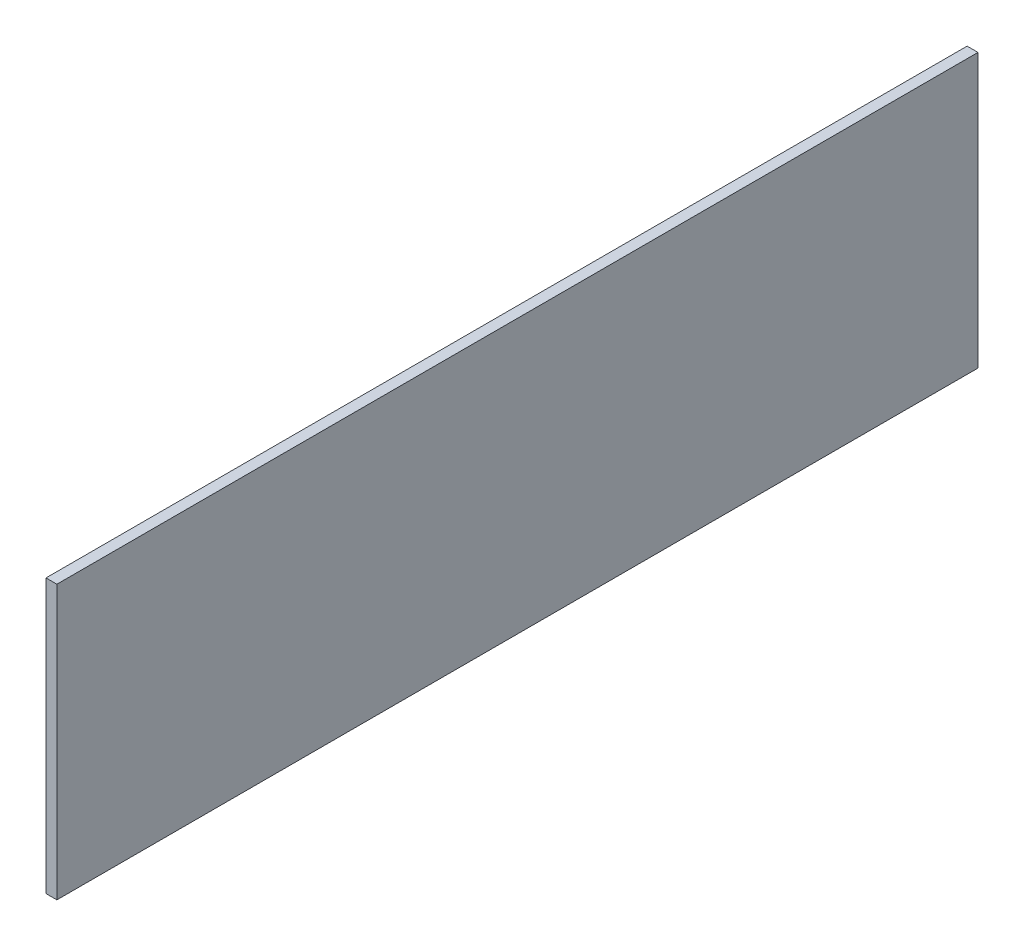
ISO-10303-21;
HEADER;
FILE_DESCRIPTION(('STEP AP214'),'2;1');
FILE_NAME('part.step','',(''),(''),'','','');
FILE_SCHEMA(('AUTOMOTIVE_DESIGN { 1 0 10303 214 1 1 1 1 }'));
ENDSEC;
DATA;
#1=APPLICATION_CONTEXT('core data for automotive mechanical design processes');
#2=APPLICATION_PROTOCOL_DEFINITION('international standard','automotive_design',2000,#1);
#3=PRODUCT_CONTEXT('',#1,'mechanical');
#4=PRODUCT('Part','Part','',(#3));
#5=PRODUCT_RELATED_PRODUCT_CATEGORY('part','',(#4));
#6=PRODUCT_DEFINITION_FORMATION('','',#4);
#7=PRODUCT_DEFINITION_CONTEXT('part definition',#1,'design');
#8=PRODUCT_DEFINITION('design','',#6,#7);
#9=PRODUCT_DEFINITION_SHAPE('','',#8);
#10=(LENGTH_UNIT() NAMED_UNIT(*) SI_UNIT(.MILLI.,.METRE.));
#11=(NAMED_UNIT(*) PLANE_ANGLE_UNIT() SI_UNIT($,.RADIAN.));
#12=(NAMED_UNIT(*) SI_UNIT($,.STERADIAN.) SOLID_ANGLE_UNIT());
#13=UNCERTAINTY_MEASURE_WITH_UNIT(LENGTH_MEASURE(1.E-05),#10,'distance_accuracy_value','');
#14=(GEOMETRIC_REPRESENTATION_CONTEXT(3) GLOBAL_UNCERTAINTY_ASSIGNED_CONTEXT((#13)) GLOBAL_UNIT_ASSIGNED_CONTEXT((#10,
#11,#12)) REPRESENTATION_CONTEXT('',''));
#15=CARTESIAN_POINT('',(0.,0.,0.));
#16=DIRECTION('',(0.,0.,1.));
#17=DIRECTION('',(1.,0.,0.));
#18=AXIS2_PLACEMENT_3D('',#15,#16,#17);
#19=CARTESIAN_POINT('',(84.0142757664545,-1.20224180191051,93.));
#20=DIRECTION('',(1.,0.,0.));
#21=DIRECTION('',(0.,0.,-1.));
#22=AXIS2_PLACEMENT_3D('',#19,#20,#21);
#23=PLANE('',#22);
#24=DIRECTION('',(0.,-1.,0.));
#25=VECTOR('',#24,1.);
#26=CARTESIAN_POINT('',(84.0142757664545,-1.20224180191051,0.));
#27=LINE('',#26,#25);
#28=CARTESIAN_POINT('',(84.0142757664545,-1.20224180191051,0.));
#29=VERTEX_POINT('',#28);
#30=CARTESIAN_POINT('',(84.0142757664545,-28.8051279787057,0.));
#31=VERTEX_POINT('',#30);
#32=EDGE_CURVE('E96',#29,#31,#27,.T.);
#33=ORIENTED_EDGE('',*,*,#32,.T.);
#34=DIRECTION('',(0.,0.,-1.));
#35=VECTOR('',#34,1.);
#36=CARTESIAN_POINT('',(84.0142757664545,-28.8051279787057,93.));
#37=LINE('',#36,#35);
#38=CARTESIAN_POINT('',(84.0142757664545,-28.8051279787057,93.));
#39=VERTEX_POINT('',#38);
#40=EDGE_CURVE('E11',#39,#31,#37,.T.);
#41=ORIENTED_EDGE('',*,*,#40,.F.);
#42=DIRECTION('',(0.,-1.,0.));
#43=VECTOR('',#42,1.);
#44=CARTESIAN_POINT('',(84.0142757664545,-1.20224180191051,93.));
#45=LINE('',#44,#43);
#46=CARTESIAN_POINT('',(84.0142757664545,-1.20224180191051,93.));
#47=VERTEX_POINT('',#46);
#48=EDGE_CURVE('E84',#47,#39,#45,.T.);
#49=ORIENTED_EDGE('',*,*,#48,.F.);
#50=DIRECTION('',(0.,0.,-1.));
#51=VECTOR('',#50,1.);
#52=CARTESIAN_POINT('',(84.0142757664545,-1.20224180191051,93.));
#53=LINE('',#52,#51);
#54=EDGE_CURVE('E92',#47,#29,#53,.T.);
#55=ORIENTED_EDGE('',*,*,#54,.T.);
#56=EDGE_LOOP('',(#33,#41,#49,#55));
#57=FACE_BOUND('',#56,.T.);
#58=ADVANCED_FACE('F33',(#57),#23,.F.);
#59=CARTESIAN_POINT('',(84.0142757664545,-28.8051279787057,93.));
#60=DIRECTION('',(0.,1.,0.));
#61=DIRECTION('',(0.,0.,1.));
#62=AXIS2_PLACEMENT_3D('',#59,#60,#61);
#63=PLANE('',#62);
#64=DIRECTION('',(1.,0.,0.));
#65=VECTOR('',#64,1.);
#66=CARTESIAN_POINT('',(84.0142757664545,-28.8051279787057,0.));
#67=LINE('',#66,#65);
#68=CARTESIAN_POINT('',(85.1142757664545,-28.8051279787057,0.));
#69=VERTEX_POINT('',#68);
#70=EDGE_CURVE('E88',#31,#69,#67,.T.);
#71=ORIENTED_EDGE('',*,*,#70,.T.);
#72=DIRECTION('',(0.,0.,-1.));
#73=VECTOR('',#72,1.);
#74=CARTESIAN_POINT('',(85.1142757664545,-28.8051279787057,93.));
#75=LINE('',#74,#73);
#76=CARTESIAN_POINT('',(85.1142757664545,-28.8051279787057,93.));
#77=VERTEX_POINT('',#76);
#78=EDGE_CURVE('E41',#77,#69,#75,.T.);
#79=ORIENTED_EDGE('',*,*,#78,.F.);
#80=DIRECTION('',(1.,0.,0.));
#81=VECTOR('',#80,1.);
#82=CARTESIAN_POINT('',(84.0142757664545,-28.8051279787057,93.));
#83=LINE('',#82,#81);
#84=EDGE_CURVE('E79',#39,#77,#83,.T.);
#85=ORIENTED_EDGE('',*,*,#84,.F.);
#86=ORIENTED_EDGE('',*,*,#40,.T.);
#87=EDGE_LOOP('',(#71,#79,#85,#86));
#88=FACE_BOUND('',#87,.T.);
#89=ADVANCED_FACE('F87',(#88),#63,.F.);
#90=CARTESIAN_POINT('',(85.1142757664545,-28.8051279787057,93.));
#91=DIRECTION('',(-1.,0.,0.));
#92=DIRECTION('',(0.,0.,1.));
#93=AXIS2_PLACEMENT_3D('',#90,#91,#92);
#94=PLANE('',#93);
#95=DIRECTION('',(0.,1.,0.));
#96=VECTOR('',#95,1.);
#97=CARTESIAN_POINT('',(85.1142757664545,-28.8051279787057,0.));
#98=LINE('',#97,#96);
#99=CARTESIAN_POINT('',(85.1142757664545,-1.20224180191051,0.));
#100=VERTEX_POINT('',#99);
#101=EDGE_CURVE('E66',#69,#100,#98,.T.);
#102=ORIENTED_EDGE('',*,*,#101,.T.);
#103=DIRECTION('',(0.,0.,-1.));
#104=VECTOR('',#103,1.);
#105=CARTESIAN_POINT('',(85.1142757664545,-1.20224180191051,93.));
#106=LINE('',#105,#104);
#107=CARTESIAN_POINT('',(85.1142757664545,-1.20224180191051,93.));
#108=VERTEX_POINT('',#107);
#109=EDGE_CURVE('E89',#108,#100,#106,.T.);
#110=ORIENTED_EDGE('',*,*,#109,.F.);
#111=DIRECTION('',(0.,1.,0.));
#112=VECTOR('',#111,1.);
#113=CARTESIAN_POINT('',(85.1142757664545,-28.8051279787057,93.));
#114=LINE('',#113,#112);
#115=EDGE_CURVE('E82',#77,#108,#114,.T.);
#116=ORIENTED_EDGE('',*,*,#115,.F.);
#117=ORIENTED_EDGE('',*,*,#78,.T.);
#118=EDGE_LOOP('',(#102,#110,#116,#117));
#119=FACE_BOUND('',#118,.T.);
#120=ADVANCED_FACE('F90',(#119),#94,.F.);
#121=CARTESIAN_POINT('',(85.1142757664545,-1.20224180191051,93.));
#122=DIRECTION('',(0.,-1.,0.));
#123=DIRECTION('',(0.,0.,-1.));
#124=AXIS2_PLACEMENT_3D('',#121,#122,#123);
#125=PLANE('',#124);
#126=DIRECTION('',(-1.,0.,0.));
#127=VECTOR('',#126,1.);
#128=CARTESIAN_POINT('',(85.1142757664545,-1.20224180191051,0.));
#129=LINE('',#128,#127);
#130=EDGE_CURVE('E72',#100,#29,#129,.T.);
#131=ORIENTED_EDGE('',*,*,#130,.T.);
#132=ORIENTED_EDGE('',*,*,#54,.F.);
#133=DIRECTION('',(-1.,0.,0.));
#134=VECTOR('',#133,1.);
#135=CARTESIAN_POINT('',(85.1142757664545,-1.20224180191051,93.));
#136=LINE('',#135,#134);
#137=EDGE_CURVE('E49',#108,#47,#136,.T.);
#138=ORIENTED_EDGE('',*,*,#137,.F.);
#139=ORIENTED_EDGE('',*,*,#109,.T.);
#140=EDGE_LOOP('',(#131,#132,#138,#139));
#141=FACE_BOUND('',#140,.T.);
#142=ADVANCED_FACE('F103',(#141),#125,.F.);
#143=CARTESIAN_POINT('',(0.,0.,93.));
#144=DIRECTION('',(0.,0.,1.));
#145=DIRECTION('',(1.,0.,0.));
#146=AXIS2_PLACEMENT_3D('',#143,#144,#145);
#147=PLANE('',#146);
#148=ORIENTED_EDGE('',*,*,#48,.T.);
#149=ORIENTED_EDGE('',*,*,#84,.T.);
#150=ORIENTED_EDGE('',*,*,#115,.T.);
#151=ORIENTED_EDGE('',*,*,#137,.T.);
#152=EDGE_LOOP('',(#148,#149,#150,#151));
#153=FACE_BOUND('',#152,.T.);
#154=ADVANCED_FACE('F80',(#153),#147,.T.);
#155=CARTESIAN_POINT('',(0.,0.,0.));
#156=DIRECTION('',(0.,0.,1.));
#157=DIRECTION('',(1.,0.,0.));
#158=AXIS2_PLACEMENT_3D('',#155,#156,#157);
#159=PLANE('',#158);
#160=ORIENTED_EDGE('',*,*,#32,.F.);
#161=ORIENTED_EDGE('',*,*,#130,.F.);
#162=ORIENTED_EDGE('',*,*,#101,.F.);
#163=ORIENTED_EDGE('',*,*,#70,.F.);
#164=EDGE_LOOP('',(#160,#161,#162,#163));
#165=FACE_BOUND('',#164,.T.);
#166=ADVANCED_FACE('F106',(#165),#159,.F.);
#167=CLOSED_SHELL('',(#58,#89,#120,#142,#154,#166));
#168=MANIFOLD_SOLID_BREP('B2',#167);
#169=ADVANCED_BREP_SHAPE_REPRESENTATION('',(#18,#168),#14);
#170=SHAPE_DEFINITION_REPRESENTATION(#9,#169);
ENDSEC;
END-ISO-10303-21;
